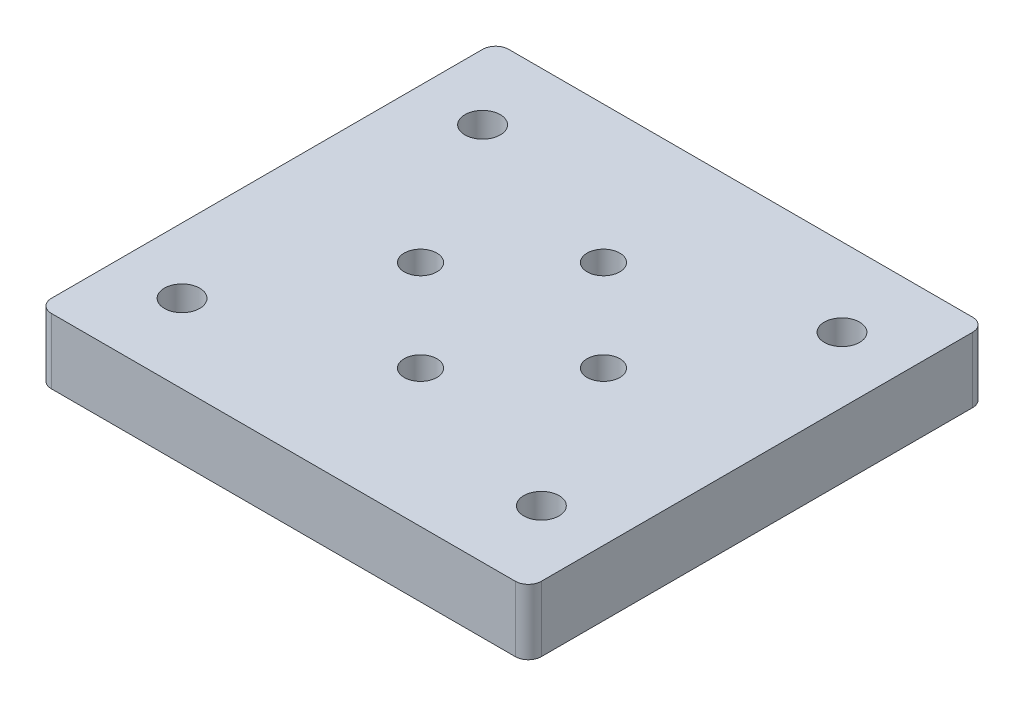
ISO-10303-21;
HEADER;
FILE_DESCRIPTION(('STEP AP214'),'2;1');
FILE_NAME('part.step','',(''),(''),'','','');
FILE_SCHEMA(('AUTOMOTIVE_DESIGN { 1 0 10303 214 1 1 1 1 }'));
ENDSEC;
DATA;
#1=APPLICATION_CONTEXT('core data for automotive mechanical design processes');
#2=APPLICATION_PROTOCOL_DEFINITION('international standard','automotive_design',2000,#1);
#3=PRODUCT_CONTEXT('',#1,'mechanical');
#4=PRODUCT('Part','Part','',(#3));
#5=PRODUCT_RELATED_PRODUCT_CATEGORY('part','',(#4));
#6=PRODUCT_DEFINITION_FORMATION('','',#4);
#7=PRODUCT_DEFINITION_CONTEXT('part definition',#1,'design');
#8=PRODUCT_DEFINITION('design','',#6,#7);
#9=PRODUCT_DEFINITION_SHAPE('','',#8);
#10=(LENGTH_UNIT() NAMED_UNIT(*) SI_UNIT(.MILLI.,.METRE.));
#11=(NAMED_UNIT(*) PLANE_ANGLE_UNIT() SI_UNIT($,.RADIAN.));
#12=(NAMED_UNIT(*) SI_UNIT($,.STERADIAN.) SOLID_ANGLE_UNIT());
#13=UNCERTAINTY_MEASURE_WITH_UNIT(LENGTH_MEASURE(1.E-05),#10,'distance_accuracy_value','');
#14=(GEOMETRIC_REPRESENTATION_CONTEXT(3) GLOBAL_UNCERTAINTY_ASSIGNED_CONTEXT((#13)) GLOBAL_UNIT_ASSIGNED_CONTEXT((#10,
#11,#12)) REPRESENTATION_CONTEXT('',''));
#15=CARTESIAN_POINT('',(0.,0.,0.));
#16=DIRECTION('',(0.,0.,1.));
#17=DIRECTION('',(1.,0.,0.));
#18=AXIS2_PLACEMENT_3D('',#15,#16,#17);
#19=CARTESIAN_POINT('',(0.,0.,0.));
#20=DIRECTION('',(0.,1.,0.));
#21=DIRECTION('',(0.,0.,1.));
#22=AXIS2_PLACEMENT_3D('',#19,#20,#21);
#23=PLANE('',#22);
#24=CARTESIAN_POINT('',(0.,0.,0.));
#25=DIRECTION('',(0.,1.,0.));
#26=DIRECTION('',(0.,0.,1.));
#27=AXIS2_PLACEMENT_3D('',#24,#25,#26);
#28=CIRCLE('',#27,11.);
#29=CARTESIAN_POINT('',(0.,0.,11.));
#30=VERTEX_POINT('',#29);
#31=EDGE_CURVE('E215',#30,#30,#28,.T.);
#32=ORIENTED_EDGE('',*,*,#31,.F.);
#33=EDGE_LOOP('',(#32));
#34=FACE_BOUND('',#33,.T.);
#35=CARTESIAN_POINT('',(0.,0.,-7.));
#36=DIRECTION('',(0.,1.,0.));
#37=DIRECTION('',(0.,0.,1.));
#38=AXIS2_PLACEMENT_3D('',#35,#36,#37);
#39=CIRCLE('',#38,1.25);
#40=CARTESIAN_POINT('',(0.,0.,-5.75));
#41=VERTEX_POINT('',#40);
#42=EDGE_CURVE('E212',#41,#41,#39,.T.);
#43=ORIENTED_EDGE('',*,*,#42,.T.);
#44=EDGE_LOOP('',(#43));
#45=FACE_BOUND('',#44,.T.);
#46=CARTESIAN_POINT('',(7.,0.,0.));
#47=DIRECTION('',(0.,1.,0.));
#48=DIRECTION('',(0.,0.,1.));
#49=AXIS2_PLACEMENT_3D('',#46,#47,#48);
#50=CIRCLE('',#49,1.25);
#51=CARTESIAN_POINT('',(7.,0.,1.25));
#52=VERTEX_POINT('',#51);
#53=EDGE_CURVE('E209',#52,#52,#50,.T.);
#54=ORIENTED_EDGE('',*,*,#53,.T.);
#55=EDGE_LOOP('',(#54));
#56=FACE_BOUND('',#55,.T.);
#57=CARTESIAN_POINT('',(0.,0.,7.));
#58=DIRECTION('',(0.,1.,0.));
#59=DIRECTION('',(0.,0.,1.));
#60=AXIS2_PLACEMENT_3D('',#57,#58,#59);
#61=CIRCLE('',#60,1.25);
#62=CARTESIAN_POINT('',(0.,0.,8.25));
#63=VERTEX_POINT('',#62);
#64=EDGE_CURVE('E206',#63,#63,#61,.T.);
#65=ORIENTED_EDGE('',*,*,#64,.T.);
#66=EDGE_LOOP('',(#65));
#67=FACE_BOUND('',#66,.T.);
#68=CARTESIAN_POINT('',(-7.,0.,0.));
#69=DIRECTION('',(0.,1.,0.));
#70=DIRECTION('',(0.,0.,1.));
#71=AXIS2_PLACEMENT_3D('',#68,#69,#70);
#72=CIRCLE('',#71,1.25);
#73=CARTESIAN_POINT('',(-7.,0.,1.25));
#74=VERTEX_POINT('',#73);
#75=EDGE_CURVE('E203',#74,#74,#72,.T.);
#76=ORIENTED_EDGE('',*,*,#75,.T.);
#77=EDGE_LOOP('',(#76));
#78=FACE_BOUND('',#77,.T.);
#79=ADVANCED_FACE('F40',(#34,#45,#56,#67,#78),#23,.F.);
#80=CARTESIAN_POINT('',(0.,5.,0.));
#81=DIRECTION('',(0.,-1.,0.));
#82=DIRECTION('',(0.,0.,-1.));
#83=AXIS2_PLACEMENT_3D('',#80,#81,#82);
#84=CYLINDRICAL_SURFACE('',#83,11.);
#85=CARTESIAN_POINT('',(0.,4.5,0.));
#86=DIRECTION('',(0.,1.,0.));
#87=DIRECTION('',(0.,0.,1.));
#88=AXIS2_PLACEMENT_3D('',#85,#86,#87);
#89=CIRCLE('',#88,11.);
#90=CARTESIAN_POINT('',(0.,4.5,11.));
#91=VERTEX_POINT('',#90);
#92=EDGE_CURVE('E11',#91,#91,#89,.F.);
#93=ORIENTED_EDGE('',*,*,#92,.T.);
#94=EDGE_LOOP('',(#93));
#95=FACE_BOUND('',#94,.T.);
#96=ORIENTED_EDGE('',*,*,#31,.T.);
#97=EDGE_LOOP('',(#96));
#98=FACE_BOUND('',#97,.T.);
#99=ADVANCED_FACE('F231',(#95,#98),#84,.T.);
#100=CARTESIAN_POINT('',(0.,5.,-7.));
#101=DIRECTION('',(0.,-1.,0.));
#102=DIRECTION('',(0.,0.,-1.));
#103=AXIS2_PLACEMENT_3D('',#100,#101,#102);
#104=CYLINDRICAL_SURFACE('',#103,1.25);
#105=ORIENTED_EDGE('',*,*,#42,.F.);
#106=EDGE_LOOP('',(#105));
#107=FACE_BOUND('',#106,.T.);
#108=CARTESIAN_POINT('',(0.,10.,-7.));
#109=DIRECTION('',(0.,1.,0.));
#110=DIRECTION('',(0.,0.,1.));
#111=AXIS2_PLACEMENT_3D('',#108,#109,#110);
#112=CIRCLE('',#111,1.25);
#113=CARTESIAN_POINT('',(0.,10.,-5.75));
#114=VERTEX_POINT('',#113);
#115=EDGE_CURVE('E149',#114,#114,#112,.F.);
#116=ORIENTED_EDGE('',*,*,#115,.F.);
#117=EDGE_LOOP('',(#116));
#118=FACE_BOUND('',#117,.T.);
#119=ADVANCED_FACE('F237',(#107,#118),#104,.F.);
#120=CARTESIAN_POINT('',(7.,5.,0.));
#121=DIRECTION('',(0.,-1.,0.));
#122=DIRECTION('',(0.,0.,-1.));
#123=AXIS2_PLACEMENT_3D('',#120,#121,#122);
#124=CYLINDRICAL_SURFACE('',#123,1.25);
#125=ORIENTED_EDGE('',*,*,#53,.F.);
#126=EDGE_LOOP('',(#125));
#127=FACE_BOUND('',#126,.T.);
#128=CARTESIAN_POINT('',(7.,10.,0.));
#129=DIRECTION('',(0.,1.,0.));
#130=DIRECTION('',(0.,0.,1.));
#131=AXIS2_PLACEMENT_3D('',#128,#129,#130);
#132=CIRCLE('',#131,1.25);
#133=CARTESIAN_POINT('',(7.,10.,1.25));
#134=VERTEX_POINT('',#133);
#135=EDGE_CURVE('E152',#134,#134,#132,.F.);
#136=ORIENTED_EDGE('',*,*,#135,.F.);
#137=EDGE_LOOP('',(#136));
#138=FACE_BOUND('',#137,.T.);
#139=ADVANCED_FACE('F244',(#127,#138),#124,.F.);
#140=CARTESIAN_POINT('',(0.,5.,7.));
#141=DIRECTION('',(0.,-1.,0.));
#142=DIRECTION('',(0.,0.,-1.));
#143=AXIS2_PLACEMENT_3D('',#140,#141,#142);
#144=CYLINDRICAL_SURFACE('',#143,1.25);
#145=ORIENTED_EDGE('',*,*,#64,.F.);
#146=EDGE_LOOP('',(#145));
#147=FACE_BOUND('',#146,.T.);
#148=CARTESIAN_POINT('',(0.,10.,7.));
#149=DIRECTION('',(0.,1.,0.));
#150=DIRECTION('',(0.,0.,1.));
#151=AXIS2_PLACEMENT_3D('',#148,#149,#150);
#152=CIRCLE('',#151,1.25);
#153=CARTESIAN_POINT('',(0.,10.,8.25));
#154=VERTEX_POINT('',#153);
#155=EDGE_CURVE('E158',#154,#154,#152,.F.);
#156=ORIENTED_EDGE('',*,*,#155,.F.);
#157=EDGE_LOOP('',(#156));
#158=FACE_BOUND('',#157,.T.);
#159=ADVANCED_FACE('F248',(#147,#158),#144,.F.);
#160=CARTESIAN_POINT('',(-7.,5.,0.));
#161=DIRECTION('',(0.,-1.,0.));
#162=DIRECTION('',(0.,0.,-1.));
#163=AXIS2_PLACEMENT_3D('',#160,#161,#162);
#164=CYLINDRICAL_SURFACE('',#163,1.25);
#165=ORIENTED_EDGE('',*,*,#75,.F.);
#166=EDGE_LOOP('',(#165));
#167=FACE_BOUND('',#166,.T.);
#168=CARTESIAN_POINT('',(-7.,10.,0.));
#169=DIRECTION('',(0.,1.,0.));
#170=DIRECTION('',(0.,0.,1.));
#171=AXIS2_PLACEMENT_3D('',#168,#169,#170);
#172=CIRCLE('',#171,1.25);
#173=CARTESIAN_POINT('',(-7.,10.,1.25));
#174=VERTEX_POINT('',#173);
#175=EDGE_CURVE('E155',#174,#174,#172,.F.);
#176=ORIENTED_EDGE('',*,*,#175,.F.);
#177=EDGE_LOOP('',(#176));
#178=FACE_BOUND('',#177,.T.);
#179=ADVANCED_FACE('F252',(#167,#178),#164,.F.);
#180=CARTESIAN_POINT('',(-17.75,10.,-16.5));
#181=DIRECTION('',(0.,-1.,0.));
#182=DIRECTION('',(0.,0.,-1.));
#183=AXIS2_PLACEMENT_3D('',#180,#181,#182);
#184=CYLINDRICAL_SURFACE('',#183,0.999999999999997);
#185=CARTESIAN_POINT('',(-17.75,5.,-16.5));
#186=DIRECTION('',(0.,1.,0.));
#187=DIRECTION('',(0.,0.,1.));
#188=AXIS2_PLACEMENT_3D('',#185,#186,#187);
#189=CIRCLE('',#188,0.999999999999997);
#190=CARTESIAN_POINT('',(-18.75,5.,-16.5));
#191=VERTEX_POINT('',#190);
#192=CARTESIAN_POINT('',(-17.75,5.,-17.5));
#193=VERTEX_POINT('',#192);
#194=EDGE_CURVE('E161',#191,#193,#189,.F.);
#195=ORIENTED_EDGE('',*,*,#194,.F.);
#196=DIRECTION('',(0.,-1.,0.));
#197=VECTOR('',#196,1.);
#198=CARTESIAN_POINT('',(-18.75,10.,-16.5));
#199=LINE('',#198,#197);
#200=CARTESIAN_POINT('',(-18.75,10.,-16.5));
#201=VERTEX_POINT('',#200);
#202=EDGE_CURVE('E92',#201,#191,#199,.T.);
#203=ORIENTED_EDGE('',*,*,#202,.F.);
#204=CARTESIAN_POINT('',(-17.75,10.,-16.5));
#205=DIRECTION('',(0.,1.,0.));
#206=DIRECTION('',(0.,0.,1.));
#207=AXIS2_PLACEMENT_3D('',#204,#205,#206);
#208=CIRCLE('',#207,0.999999999999997);
#209=CARTESIAN_POINT('',(-17.75,10.,-17.5));
#210=VERTEX_POINT('',#209);
#211=EDGE_CURVE('E191',#201,#210,#208,.F.);
#212=ORIENTED_EDGE('',*,*,#211,.T.);
#213=DIRECTION('',(0.,-1.,0.));
#214=VECTOR('',#213,1.);
#215=CARTESIAN_POINT('',(-17.75,10.,-17.5));
#216=LINE('',#215,#214);
#217=EDGE_CURVE('E57',#210,#193,#216,.T.);
#218=ORIENTED_EDGE('',*,*,#217,.T.);
#219=EDGE_LOOP('',(#195,#203,#212,#218));
#220=FACE_BOUND('',#219,.T.);
#221=ADVANCED_FACE('F256',(#220),#184,.T.);
#222=CARTESIAN_POINT('',(-18.75,10.,0.));
#223=DIRECTION('',(-1.,0.,0.));
#224=DIRECTION('',(0.,0.,1.));
#225=AXIS2_PLACEMENT_3D('',#222,#223,#224);
#226=PLANE('',#225);
#227=DIRECTION('',(0.,0.,-1.));
#228=VECTOR('',#227,1.);
#229=CARTESIAN_POINT('',(-18.75,5.,0.));
#230=LINE('',#229,#228);
#231=CARTESIAN_POINT('',(-18.75,5.,16.5));
#232=VERTEX_POINT('',#231);
#233=EDGE_CURVE('E163',#232,#191,#230,.T.);
#234=ORIENTED_EDGE('',*,*,#233,.F.);
#235=DIRECTION('',(0.,-1.,0.));
#236=VECTOR('',#235,1.);
#237=CARTESIAN_POINT('',(-18.75,10.,16.5));
#238=LINE('',#237,#236);
#239=CARTESIAN_POINT('',(-18.75,10.,16.5));
#240=VERTEX_POINT('',#239);
#241=EDGE_CURVE('E200',#240,#232,#238,.T.);
#242=ORIENTED_EDGE('',*,*,#241,.F.);
#243=DIRECTION('',(0.,0.,-1.));
#244=VECTOR('',#243,1.);
#245=CARTESIAN_POINT('',(-18.75,10.,0.));
#246=LINE('',#245,#244);
#247=EDGE_CURVE('E530',#240,#201,#246,.T.);
#248=ORIENTED_EDGE('',*,*,#247,.T.);
#249=ORIENTED_EDGE('',*,*,#202,.T.);
#250=EDGE_LOOP('',(#234,#242,#248,#249));
#251=FACE_BOUND('',#250,.T.);
#252=ADVANCED_FACE('F260',(#251),#226,.T.);
#253=CARTESIAN_POINT('',(-17.75,10.,16.5));
#254=DIRECTION('',(0.,-1.,0.));
#255=DIRECTION('',(0.,0.,-1.));
#256=AXIS2_PLACEMENT_3D('',#253,#254,#255);
#257=CYLINDRICAL_SURFACE('',#256,1.);
#258=CARTESIAN_POINT('',(-17.75,5.,16.5));
#259=DIRECTION('',(0.,1.,0.));
#260=DIRECTION('',(0.,0.,1.));
#261=AXIS2_PLACEMENT_3D('',#258,#259,#260);
#262=CIRCLE('',#261,1.);
#263=CARTESIAN_POINT('',(-17.75,5.,17.5));
#264=VERTEX_POINT('',#263);
#265=EDGE_CURVE('E166',#264,#232,#262,.F.);
#266=ORIENTED_EDGE('',*,*,#265,.F.);
#267=DIRECTION('',(0.,-1.,0.));
#268=VECTOR('',#267,1.);
#269=CARTESIAN_POINT('',(-17.75,10.,17.5));
#270=LINE('',#269,#268);
#271=CARTESIAN_POINT('',(-17.75,10.,17.5));
#272=VERTEX_POINT('',#271);
#273=EDGE_CURVE('E198',#272,#264,#270,.T.);
#274=ORIENTED_EDGE('',*,*,#273,.F.);
#275=CARTESIAN_POINT('',(-17.75,10.,16.5));
#276=DIRECTION('',(0.,1.,0.));
#277=DIRECTION('',(0.,0.,1.));
#278=AXIS2_PLACEMENT_3D('',#275,#276,#277);
#279=CIRCLE('',#278,1.);
#280=EDGE_CURVE('E533',#272,#240,#279,.F.);
#281=ORIENTED_EDGE('',*,*,#280,.T.);
#282=ORIENTED_EDGE('',*,*,#241,.T.);
#283=EDGE_LOOP('',(#266,#274,#281,#282));
#284=FACE_BOUND('',#283,.T.);
#285=ADVANCED_FACE('F263',(#284),#257,.T.);
#286=CARTESIAN_POINT('',(0.,10.,17.5));
#287=DIRECTION('',(0.,0.,-1.));
#288=DIRECTION('',(-1.,0.,0.));
#289=AXIS2_PLACEMENT_3D('',#286,#287,#288);
#290=PLANE('',#289);
#291=DIRECTION('',(1.,0.,0.));
#292=VECTOR('',#291,1.);
#293=CARTESIAN_POINT('',(0.,5.,17.5));
#294=LINE('',#293,#292);
#295=CARTESIAN_POINT('',(17.75,5.,17.5));
#296=VERTEX_POINT('',#295);
#297=EDGE_CURVE('E169',#264,#296,#294,.T.);
#298=ORIENTED_EDGE('',*,*,#297,.T.);
#299=DIRECTION('',(0.,-1.,0.));
#300=VECTOR('',#299,1.);
#301=CARTESIAN_POINT('',(17.75,10.,17.5));
#302=LINE('',#301,#300);
#303=CARTESIAN_POINT('',(17.75,10.,17.5));
#304=VERTEX_POINT('',#303);
#305=EDGE_CURVE('E195',#304,#296,#302,.T.);
#306=ORIENTED_EDGE('',*,*,#305,.F.);
#307=DIRECTION('',(1.,0.,0.));
#308=VECTOR('',#307,1.);
#309=CARTESIAN_POINT('',(0.,10.,17.5));
#310=LINE('',#309,#308);
#311=EDGE_CURVE('E535',#272,#304,#310,.T.);
#312=ORIENTED_EDGE('',*,*,#311,.F.);
#313=ORIENTED_EDGE('',*,*,#273,.T.);
#314=EDGE_LOOP('',(#298,#306,#312,#313));
#315=FACE_BOUND('',#314,.T.);
#316=ADVANCED_FACE('F267',(#315),#290,.F.);
#317=CARTESIAN_POINT('',(17.75,10.,16.5));
#318=DIRECTION('',(0.,-1.,0.));
#319=DIRECTION('',(0.,0.,-1.));
#320=AXIS2_PLACEMENT_3D('',#317,#318,#319);
#321=CYLINDRICAL_SURFACE('',#320,1.);
#322=CARTESIAN_POINT('',(17.75,5.,16.5));
#323=DIRECTION('',(0.,1.,0.));
#324=DIRECTION('',(0.,0.,1.));
#325=AXIS2_PLACEMENT_3D('',#322,#323,#324);
#326=CIRCLE('',#325,1.);
#327=CARTESIAN_POINT('',(18.75,5.,16.5));
#328=VERTEX_POINT('',#327);
#329=EDGE_CURVE('E171',#296,#328,#326,.T.);
#330=ORIENTED_EDGE('',*,*,#329,.T.);
#331=DIRECTION('',(0.,-1.,0.));
#332=VECTOR('',#331,1.);
#333=CARTESIAN_POINT('',(18.75,10.,16.5));
#334=LINE('',#333,#332);
#335=CARTESIAN_POINT('',(18.75,10.,16.5));
#336=VERTEX_POINT('',#335);
#337=EDGE_CURVE('E129',#336,#328,#334,.T.);
#338=ORIENTED_EDGE('',*,*,#337,.F.);
#339=CARTESIAN_POINT('',(17.75,10.,16.5));
#340=DIRECTION('',(0.,1.,0.));
#341=DIRECTION('',(0.,0.,1.));
#342=AXIS2_PLACEMENT_3D('',#339,#340,#341);
#343=CIRCLE('',#342,1.);
#344=EDGE_CURVE('E117',#304,#336,#343,.T.);
#345=ORIENTED_EDGE('',*,*,#344,.F.);
#346=ORIENTED_EDGE('',*,*,#305,.T.);
#347=EDGE_LOOP('',(#330,#338,#345,#346));
#348=FACE_BOUND('',#347,.T.);
#349=ADVANCED_FACE('F271',(#348),#321,.T.);
#350=CARTESIAN_POINT('',(18.75,10.,0.));
#351=DIRECTION('',(-1.,0.,0.));
#352=DIRECTION('',(0.,0.,1.));
#353=AXIS2_PLACEMENT_3D('',#350,#351,#352);
#354=PLANE('',#353);
#355=DIRECTION('',(0.,0.,-1.));
#356=VECTOR('',#355,1.);
#357=CARTESIAN_POINT('',(18.75,5.,0.));
#358=LINE('',#357,#356);
#359=CARTESIAN_POINT('',(18.75,5.,-16.5));
#360=VERTEX_POINT('',#359);
#361=EDGE_CURVE('E126',#328,#360,#358,.T.);
#362=ORIENTED_EDGE('',*,*,#361,.T.);
#363=DIRECTION('',(0.,-1.,0.));
#364=VECTOR('',#363,1.);
#365=CARTESIAN_POINT('',(18.75,10.,-16.5));
#366=LINE('',#365,#364);
#367=CARTESIAN_POINT('',(18.75,10.,-16.5));
#368=VERTEX_POINT('',#367);
#369=EDGE_CURVE('E123',#368,#360,#366,.T.);
#370=ORIENTED_EDGE('',*,*,#369,.F.);
#371=DIRECTION('',(0.,0.,-1.));
#372=VECTOR('',#371,1.);
#373=CARTESIAN_POINT('',(18.75,10.,0.));
#374=LINE('',#373,#372);
#375=EDGE_CURVE('E109',#336,#368,#374,.T.);
#376=ORIENTED_EDGE('',*,*,#375,.F.);
#377=ORIENTED_EDGE('',*,*,#337,.T.);
#378=EDGE_LOOP('',(#362,#370,#376,#377));
#379=FACE_BOUND('',#378,.T.);
#380=ADVANCED_FACE('F124',(#379),#354,.F.);
#381=CARTESIAN_POINT('',(17.75,10.,-16.5));
#382=DIRECTION('',(0.,-1.,0.));
#383=DIRECTION('',(0.,0.,-1.));
#384=AXIS2_PLACEMENT_3D('',#381,#382,#383);
#385=CYLINDRICAL_SURFACE('',#384,0.999999999999997);
#386=CARTESIAN_POINT('',(17.75,5.,-16.5));
#387=DIRECTION('',(0.,1.,0.));
#388=DIRECTION('',(0.,0.,1.));
#389=AXIS2_PLACEMENT_3D('',#386,#387,#388);
#390=CIRCLE('',#389,0.999999999999997);
#391=CARTESIAN_POINT('',(17.75,5.,-17.5));
#392=VERTEX_POINT('',#391);
#393=EDGE_CURVE('E174',#392,#360,#390,.F.);
#394=ORIENTED_EDGE('',*,*,#393,.F.);
#395=DIRECTION('',(0.,-1.,0.));
#396=VECTOR('',#395,1.);
#397=CARTESIAN_POINT('',(17.75,10.,-17.5));
#398=LINE('',#397,#396);
#399=CARTESIAN_POINT('',(17.75,10.,-17.5));
#400=VERTEX_POINT('',#399);
#401=EDGE_CURVE('E83',#400,#392,#398,.T.);
#402=ORIENTED_EDGE('',*,*,#401,.F.);
#403=CARTESIAN_POINT('',(17.75,10.,-16.5));
#404=DIRECTION('',(0.,1.,0.));
#405=DIRECTION('',(0.,0.,1.));
#406=AXIS2_PLACEMENT_3D('',#403,#404,#405);
#407=CIRCLE('',#406,0.999999999999997);
#408=EDGE_CURVE('E115',#400,#368,#407,.F.);
#409=ORIENTED_EDGE('',*,*,#408,.T.);
#410=ORIENTED_EDGE('',*,*,#369,.T.);
#411=EDGE_LOOP('',(#394,#402,#409,#410));
#412=FACE_BOUND('',#411,.T.);
#413=ADVANCED_FACE('F131',(#412),#385,.T.);
#414=CARTESIAN_POINT('',(-13.75,10.,-11.5));
#415=DIRECTION('',(0.,-1.,0.));
#416=DIRECTION('',(0.,0.,-1.));
#417=AXIS2_PLACEMENT_3D('',#414,#415,#416);
#418=CYLINDRICAL_SURFACE('',#417,1.35);
#419=CARTESIAN_POINT('',(-13.75,10.,-11.5));
#420=DIRECTION('',(0.,1.,0.));
#421=DIRECTION('',(0.,0.,1.));
#422=AXIS2_PLACEMENT_3D('',#419,#420,#421);
#423=CIRCLE('',#422,1.35);
#424=CARTESIAN_POINT('',(-13.75,10.,-10.15));
#425=VERTEX_POINT('',#424);
#426=EDGE_CURVE('E146',#425,#425,#423,.T.);
#427=ORIENTED_EDGE('',*,*,#426,.T.);
#428=EDGE_LOOP('',(#427));
#429=FACE_BOUND('',#428,.T.);
#430=CARTESIAN_POINT('',(-13.75,5.,-11.5));
#431=DIRECTION('',(0.,1.,0.));
#432=DIRECTION('',(0.,0.,1.));
#433=AXIS2_PLACEMENT_3D('',#430,#431,#432);
#434=CIRCLE('',#433,1.35);
#435=CARTESIAN_POINT('',(-13.75,5.,-10.15));
#436=VERTEX_POINT('',#435);
#437=EDGE_CURVE('E188',#436,#436,#434,.T.);
#438=ORIENTED_EDGE('',*,*,#437,.F.);
#439=EDGE_LOOP('',(#438));
#440=FACE_BOUND('',#439,.T.);
#441=ADVANCED_FACE('F280',(#429,#440),#418,.F.);
#442=CARTESIAN_POINT('',(-13.75,10.,11.5));
#443=DIRECTION('',(0.,-1.,0.));
#444=DIRECTION('',(0.,0.,-1.));
#445=AXIS2_PLACEMENT_3D('',#442,#443,#444);
#446=CYLINDRICAL_SURFACE('',#445,1.35);
#447=CARTESIAN_POINT('',(-13.75,10.,11.5));
#448=DIRECTION('',(0.,1.,0.));
#449=DIRECTION('',(0.,0.,1.));
#450=AXIS2_PLACEMENT_3D('',#447,#448,#449);
#451=CIRCLE('',#450,1.35);
#452=CARTESIAN_POINT('',(-13.75,10.,12.85));
#453=VERTEX_POINT('',#452);
#454=EDGE_CURVE('E143',#453,#453,#451,.T.);
#455=ORIENTED_EDGE('',*,*,#454,.T.);
#456=EDGE_LOOP('',(#455));
#457=FACE_BOUND('',#456,.T.);
#458=CARTESIAN_POINT('',(-13.75,5.,11.5));
#459=DIRECTION('',(0.,1.,0.));
#460=DIRECTION('',(0.,0.,1.));
#461=AXIS2_PLACEMENT_3D('',#458,#459,#460);
#462=CIRCLE('',#461,1.35);
#463=CARTESIAN_POINT('',(-13.75,5.,12.85));
#464=VERTEX_POINT('',#463);
#465=EDGE_CURVE('E185',#464,#464,#462,.T.);
#466=ORIENTED_EDGE('',*,*,#465,.F.);
#467=EDGE_LOOP('',(#466));
#468=FACE_BOUND('',#467,.T.);
#469=ADVANCED_FACE('F291',(#457,#468),#446,.F.);
#470=CARTESIAN_POINT('',(13.75,10.,11.5));
#471=DIRECTION('',(0.,-1.,0.));
#472=DIRECTION('',(0.,0.,-1.));
#473=AXIS2_PLACEMENT_3D('',#470,#471,#472);
#474=CYLINDRICAL_SURFACE('',#473,1.35);
#475=CARTESIAN_POINT('',(13.75,10.,11.5));
#476=DIRECTION('',(0.,1.,0.));
#477=DIRECTION('',(0.,0.,1.));
#478=AXIS2_PLACEMENT_3D('',#475,#476,#477);
#479=CIRCLE('',#478,1.35);
#480=CARTESIAN_POINT('',(13.75,10.,12.85));
#481=VERTEX_POINT('',#480);
#482=EDGE_CURVE('E140',#481,#481,#479,.T.);
#483=ORIENTED_EDGE('',*,*,#482,.T.);
#484=EDGE_LOOP('',(#483));
#485=FACE_BOUND('',#484,.T.);
#486=CARTESIAN_POINT('',(13.75,5.,11.5));
#487=DIRECTION('',(0.,1.,0.));
#488=DIRECTION('',(0.,0.,1.));
#489=AXIS2_PLACEMENT_3D('',#486,#487,#488);
#490=CIRCLE('',#489,1.35);
#491=CARTESIAN_POINT('',(13.75,5.,12.85));
#492=VERTEX_POINT('',#491);
#493=EDGE_CURVE('E182',#492,#492,#490,.T.);
#494=ORIENTED_EDGE('',*,*,#493,.F.);
#495=EDGE_LOOP('',(#494));
#496=FACE_BOUND('',#495,.T.);
#497=ADVANCED_FACE('F287',(#485,#496),#474,.F.);
#498=CARTESIAN_POINT('',(13.75,10.,-11.5));
#499=DIRECTION('',(0.,-1.,0.));
#500=DIRECTION('',(0.,0.,-1.));
#501=AXIS2_PLACEMENT_3D('',#498,#499,#500);
#502=CYLINDRICAL_SURFACE('',#501,1.35);
#503=CARTESIAN_POINT('',(13.75,10.,-11.5));
#504=DIRECTION('',(0.,1.,0.));
#505=DIRECTION('',(0.,0.,1.));
#506=AXIS2_PLACEMENT_3D('',#503,#504,#505);
#507=CIRCLE('',#506,1.35);
#508=CARTESIAN_POINT('',(13.75,10.,-10.15));
#509=VERTEX_POINT('',#508);
#510=EDGE_CURVE('E134',#509,#509,#507,.T.);
#511=ORIENTED_EDGE('',*,*,#510,.T.);
#512=EDGE_LOOP('',(#511));
#513=FACE_BOUND('',#512,.T.);
#514=CARTESIAN_POINT('',(13.75,5.,-11.5));
#515=DIRECTION('',(0.,1.,0.));
#516=DIRECTION('',(0.,0.,1.));
#517=AXIS2_PLACEMENT_3D('',#514,#515,#516);
#518=CIRCLE('',#517,1.35);
#519=CARTESIAN_POINT('',(13.75,5.,-10.15));
#520=VERTEX_POINT('',#519);
#521=EDGE_CURVE('E179',#520,#520,#518,.T.);
#522=ORIENTED_EDGE('',*,*,#521,.F.);
#523=EDGE_LOOP('',(#522));
#524=FACE_BOUND('',#523,.T.);
#525=ADVANCED_FACE('F284',(#513,#524),#502,.F.);
#526=CARTESIAN_POINT('',(0.,10.,-17.5));
#527=DIRECTION('',(0.,0.,-1.));
#528=DIRECTION('',(-1.,0.,0.));
#529=AXIS2_PLACEMENT_3D('',#526,#527,#528);
#530=PLANE('',#529);
#531=DIRECTION('',(1.,0.,0.));
#532=VECTOR('',#531,1.);
#533=CARTESIAN_POINT('',(0.,5.,-17.5));
#534=LINE('',#533,#532);
#535=EDGE_CURVE('E176',#193,#392,#534,.T.);
#536=ORIENTED_EDGE('',*,*,#535,.F.);
#537=ORIENTED_EDGE('',*,*,#217,.F.);
#538=DIRECTION('',(1.,0.,0.));
#539=VECTOR('',#538,1.);
#540=CARTESIAN_POINT('',(0.,10.,-17.5));
#541=LINE('',#540,#539);
#542=EDGE_CURVE('E132',#210,#400,#541,.T.);
#543=ORIENTED_EDGE('',*,*,#542,.T.);
#544=ORIENTED_EDGE('',*,*,#401,.T.);
#545=EDGE_LOOP('',(#536,#537,#543,#544));
#546=FACE_BOUND('',#545,.T.);
#547=ADVANCED_FACE('F281',(#546),#530,.T.);
#548=CARTESIAN_POINT('',(0.,10.,0.));
#549=DIRECTION('',(0.,1.,0.));
#550=DIRECTION('',(0.,0.,1.));
#551=AXIS2_PLACEMENT_3D('',#548,#549,#550);
#552=PLANE('',#551);
#553=ORIENTED_EDGE('',*,*,#211,.F.);
#554=ORIENTED_EDGE('',*,*,#247,.F.);
#555=ORIENTED_EDGE('',*,*,#280,.F.);
#556=ORIENTED_EDGE('',*,*,#311,.T.);
#557=ORIENTED_EDGE('',*,*,#344,.T.);
#558=ORIENTED_EDGE('',*,*,#375,.T.);
#559=ORIENTED_EDGE('',*,*,#408,.F.);
#560=ORIENTED_EDGE('',*,*,#542,.F.);
#561=EDGE_LOOP('',(#553,#554,#555,#556,#557,#558,#559,#560));
#562=FACE_BOUND('',#561,.T.);
#563=ORIENTED_EDGE('',*,*,#510,.F.);
#564=EDGE_LOOP('',(#563));
#565=FACE_BOUND('',#564,.T.);
#566=ORIENTED_EDGE('',*,*,#482,.F.);
#567=EDGE_LOOP('',(#566));
#568=FACE_BOUND('',#567,.T.);
#569=ORIENTED_EDGE('',*,*,#454,.F.);
#570=EDGE_LOOP('',(#569));
#571=FACE_BOUND('',#570,.T.);
#572=ORIENTED_EDGE('',*,*,#426,.F.);
#573=EDGE_LOOP('',(#572));
#574=FACE_BOUND('',#573,.T.);
#575=ORIENTED_EDGE('',*,*,#115,.T.);
#576=EDGE_LOOP('',(#575));
#577=FACE_BOUND('',#576,.T.);
#578=ORIENTED_EDGE('',*,*,#135,.T.);
#579=EDGE_LOOP('',(#578));
#580=FACE_BOUND('',#579,.T.);
#581=ORIENTED_EDGE('',*,*,#175,.T.);
#582=EDGE_LOOP('',(#581));
#583=FACE_BOUND('',#582,.T.);
#584=ORIENTED_EDGE('',*,*,#155,.T.);
#585=EDGE_LOOP('',(#584));
#586=FACE_BOUND('',#585,.T.);
#587=ADVANCED_FACE('F111',(#562,#565,#568,#571,#574,#577,#580,#583,#586),#552,.T.);
#588=CARTESIAN_POINT('',(0.,5.,0.));
#589=DIRECTION('',(0.,1.,0.));
#590=DIRECTION('',(0.,0.,1.));
#591=AXIS2_PLACEMENT_3D('',#588,#589,#590);
#592=PLANE('',#591);
#593=CARTESIAN_POINT('',(0.,5.,0.));
#594=DIRECTION('',(0.,1.,0.));
#595=DIRECTION('',(0.,0.,1.));
#596=AXIS2_PLACEMENT_3D('',#593,#594,#595);
#597=CIRCLE('',#596,11.5);
#598=CARTESIAN_POINT('',(0.,5.,11.5));
#599=VERTEX_POINT('',#598);
#600=EDGE_CURVE('E49',#599,#599,#597,.T.);
#601=ORIENTED_EDGE('',*,*,#600,.T.);
#602=EDGE_LOOP('',(#601));
#603=FACE_BOUND('',#602,.T.);
#604=ORIENTED_EDGE('',*,*,#194,.T.);
#605=ORIENTED_EDGE('',*,*,#535,.T.);
#606=ORIENTED_EDGE('',*,*,#393,.T.);
#607=ORIENTED_EDGE('',*,*,#361,.F.);
#608=ORIENTED_EDGE('',*,*,#329,.F.);
#609=ORIENTED_EDGE('',*,*,#297,.F.);
#610=ORIENTED_EDGE('',*,*,#265,.T.);
#611=ORIENTED_EDGE('',*,*,#233,.T.);
#612=EDGE_LOOP('',(#604,#605,#606,#607,#608,#609,#610,#611));
#613=FACE_BOUND('',#612,.T.);
#614=ORIENTED_EDGE('',*,*,#521,.T.);
#615=EDGE_LOOP('',(#614));
#616=FACE_BOUND('',#615,.T.);
#617=ORIENTED_EDGE('',*,*,#493,.T.);
#618=EDGE_LOOP('',(#617));
#619=FACE_BOUND('',#618,.T.);
#620=ORIENTED_EDGE('',*,*,#465,.T.);
#621=EDGE_LOOP('',(#620));
#622=FACE_BOUND('',#621,.T.);
#623=ORIENTED_EDGE('',*,*,#437,.T.);
#624=EDGE_LOOP('',(#623));
#625=FACE_BOUND('',#624,.T.);
#626=ADVANCED_FACE('F220',(#603,#613,#616,#619,#622,#625),#592,.F.);
#627=CARTESIAN_POINT('',(0.,4.5,0.));
#628=DIRECTION('',(0.,1.,0.));
#629=DIRECTION('',(0.,0.,1.));
#630=AXIS2_PLACEMENT_3D('',#627,#628,#629);
#631=TOROIDAL_SURFACE('',#630,11.5,0.5);
#632=ORIENTED_EDGE('',*,*,#92,.F.);
#633=EDGE_LOOP('',(#632));
#634=FACE_BOUND('',#633,.T.);
#635=ORIENTED_EDGE('',*,*,#600,.F.);
#636=EDGE_LOOP('',(#635));
#637=FACE_BOUND('',#636,.T.);
#638=ADVANCED_FACE('F42',(#634,#637),#631,.F.);
#639=CLOSED_SHELL('',(#79,#99,#119,#139,#159,#179,#221,#252,#285,#316,#349,#380,#413,#441,#469,
#497,#525,#547,#587,#626,#638));
#640=MANIFOLD_SOLID_BREP('B2',#639);
#641=ADVANCED_BREP_SHAPE_REPRESENTATION('',(#18,#640),#14);
#642=SHAPE_DEFINITION_REPRESENTATION(#9,#641);
ENDSEC;
END-ISO-10303-21;
